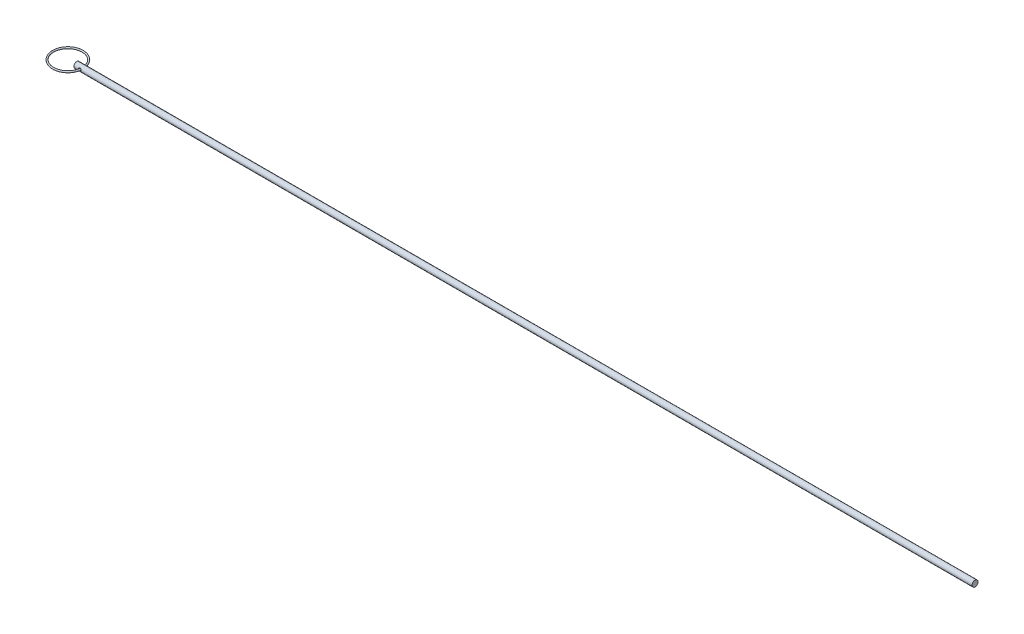
ISO-10303-21;
HEADER;
FILE_DESCRIPTION(('STEP AP214'),'2;1');
FILE_NAME('part.step','',(''),(''),'','','');
FILE_SCHEMA(('AUTOMOTIVE_DESIGN { 1 0 10303 214 1 1 1 1 }'));
ENDSEC;
DATA;
#1=APPLICATION_CONTEXT('core data for automotive mechanical design processes');
#2=APPLICATION_PROTOCOL_DEFINITION('international standard','automotive_design',2000,#1);
#3=PRODUCT_CONTEXT('',#1,'mechanical');
#4=PRODUCT('Part','Part','',(#3));
#5=PRODUCT_RELATED_PRODUCT_CATEGORY('part','',(#4));
#6=PRODUCT_DEFINITION_FORMATION('','',#4);
#7=PRODUCT_DEFINITION_CONTEXT('part definition',#1,'design');
#8=PRODUCT_DEFINITION('design','',#6,#7);
#9=PRODUCT_DEFINITION_SHAPE('','',#8);
#10=(LENGTH_UNIT() NAMED_UNIT(*) SI_UNIT(.MILLI.,.METRE.));
#11=(NAMED_UNIT(*) PLANE_ANGLE_UNIT() SI_UNIT($,.RADIAN.));
#12=(NAMED_UNIT(*) SI_UNIT($,.STERADIAN.) SOLID_ANGLE_UNIT());
#13=UNCERTAINTY_MEASURE_WITH_UNIT(LENGTH_MEASURE(1.E-05),#10,'distance_accuracy_value','');
#14=(GEOMETRIC_REPRESENTATION_CONTEXT(3) GLOBAL_UNCERTAINTY_ASSIGNED_CONTEXT((#13)) GLOBAL_UNIT_ASSIGNED_CONTEXT((#10,
#11,#12)) REPRESENTATION_CONTEXT('',''));
#15=CARTESIAN_POINT('',(0.,0.,0.));
#16=DIRECTION('',(0.,0.,1.));
#17=DIRECTION('',(1.,0.,0.));
#18=AXIS2_PLACEMENT_3D('',#15,#16,#17);
#19=CARTESIAN_POINT('',(-1.5,0.,0.));
#20=DIRECTION('',(0.,1.,0.));
#21=DIRECTION('',(-1.,0.,0.));
#22=AXIS2_PLACEMENT_3D('',#19,#20,#21);
#23=TOROIDAL_SURFACE('',#22,2.5,0.127);
#24=CARTESIAN_POINT('',(-4.127,0.,0.));
#25=VERTEX_POINT('',#24);
#26=VERTEX_LOOP('',#25);
#27=FACE_BOUND('',#26,.T.);
#28=ADVANCED_FACE('F49',(#27),#23,.T.);
#29=CLOSED_SHELL('',(#28));
#30=MANIFOLD_SOLID_BREP('B2',#29);
#31=CARTESIAN_POINT('',(152.4,0.,0.));
#32=DIRECTION('',(-1.,0.,0.));
#33=DIRECTION('',(0.,0.,1.));
#34=AXIS2_PLACEMENT_3D('',#31,#32,#33);
#35=CYLINDRICAL_SURFACE('',#34,0.5);
#36=CARTESIAN_POINT('',(1.25,0.,-0.5));
#37=CARTESIAN_POINT('',(1.24999917442012,0.0131429907382462,-0.499999283510377));
#38=CARTESIAN_POINT('',(1.24895748171958,0.0263016499245073,-0.499476227548794));
#39=CARTESIAN_POINT('',(1.24483677991477,0.0522300588171047,-0.497435390093491));
#40=CARTESIAN_POINT('',(1.24175390175059,0.0649990216783739,-0.495915719572459));
#41=CARTESIAN_POINT('',(1.2337015478458,0.0897333862201409,-0.492040698508279));
#42=CARTESIAN_POINT('',(1.228739403938,0.101701700734792,-0.489688597943801));
#43=CARTESIAN_POINT('',(1.21710734465877,0.124618154201638,-0.484364441289447));
#44=CARTESIAN_POINT('',(1.21043756393779,0.135566373497509,-0.481392434083826));
#45=CARTESIAN_POINT('',(1.19512068762868,0.156876954440476,-0.474890645645144));
#46=CARTESIAN_POINT('',(1.18637838019009,0.167163802780524,-0.471337997818841));
#47=CARTESIAN_POINT('',(1.16736963018825,0.18619486121674,-0.464149925616862));
#48=CARTESIAN_POINT('',(1.15710203705689,0.194937895776688,-0.460514440522589));
#49=CARTESIAN_POINT('',(1.13437916261916,0.211313000112566,-0.453247377993369));
#50=CARTESIAN_POINT('',(1.12181597541353,0.218806333887907,-0.449637967425331));
#51=CARTESIAN_POINT('',(1.09540816600345,0.231542056722672,-0.443214946930802));
#52=CARTESIAN_POINT('',(1.08156446781932,0.236786053741582,-0.440400769017475));
#53=CARTESIAN_POINT('',(1.05383372364452,0.244533110547147,-0.436144667594522));
#54=CARTESIAN_POINT('',(1.03999888698315,0.24718146427011,-0.434630678959284));
#55=CARTESIAN_POINT('',(1.01200529055513,0.250106748327211,-0.432954724871319));
#56=CARTESIAN_POINT('',(0.997846864782208,0.250386022093268,-0.43279142335822));
#57=CARTESIAN_POINT('',(0.971428493921153,0.248671821793073,-0.433777325643121));
#58=CARTESIAN_POINT('',(0.959143992194233,0.246946139884204,-0.434771909155034));
#59=CARTESIAN_POINT('',(0.935069522656735,0.241734962264231,-0.437690571834627));
#60=CARTESIAN_POINT('',(0.923279713673666,0.238248905974411,-0.439614947079442));
#61=CARTESIAN_POINT('',(0.900192716858581,0.229552445096499,-0.444218691031854));
#62=CARTESIAN_POINT('',(0.888913400303549,0.224303766778996,-0.446914601659998));
#63=CARTESIAN_POINT('',(0.867341426852495,0.212260421916998,-0.45275851070351));
#64=CARTESIAN_POINT('',(0.857049216099975,0.205465060953115,-0.455906711950477));
#65=CARTESIAN_POINT('',(0.836369686814192,0.189516513728196,-0.462782894758215));
#66=CARTESIAN_POINT('',(0.82613578160596,0.18017361459232,-0.466533775591866));
#67=CARTESIAN_POINT('',(0.807316145352276,0.159888894685344,-0.473869058251018));
#68=CARTESIAN_POINT('',(0.798731201991531,0.148946314143573,-0.477453379897002));
#69=CARTESIAN_POINT('',(0.78307858474257,0.125129126457965,-0.484254968207409));
#70=CARTESIAN_POINT('',(0.776099881888567,0.112188397899855,-0.487447460405018));
#71=CARTESIAN_POINT('',(0.76447574273925,0.0851165538722036,-0.492894702803105));
#72=CARTESIAN_POINT('',(0.75982845374621,0.0709863940663242,-0.495150197358881));
#73=CARTESIAN_POINT('',(0.753381149070832,0.0431916229151808,-0.49831083435359));
#74=CARTESIAN_POINT('',(0.751377191063306,0.0295853826370862,-0.499312345753279));
#75=CARTESIAN_POINT('',(0.749633817216378,0.00219489998734287,-0.500182533647755));
#76=CARTESIAN_POINT('',(0.74989332859013,-0.0115892549674712,-0.500051746803281));
#77=CARTESIAN_POINT('',(0.752551672104688,-0.0378082429964952,-0.498727980633602));
#78=CARTESIAN_POINT('',(0.754783133182507,-0.050264852012486,-0.497618114220474));
#79=CARTESIAN_POINT('',(0.761059517973771,-0.0746017230754778,-0.494555428287048));
#80=CARTESIAN_POINT('',(0.76510464161334,-0.0864819214227484,-0.492602515835831));
#81=CARTESIAN_POINT('',(0.774999616608293,-0.109722152112416,-0.487960628534174));
#82=CARTESIAN_POINT('',(0.780897762529204,-0.121057599251539,-0.485252204424848));
#83=CARTESIAN_POINT('',(0.794276883911512,-0.142615340424731,-0.479359935792772));
#84=CARTESIAN_POINT('',(0.801758533648359,-0.152837157443822,-0.476175888914462));
#85=CARTESIAN_POINT('',(0.81894010633322,-0.172941922322665,-0.46927055334366));
#86=CARTESIAN_POINT('',(0.828785717113393,-0.182693019456161,-0.465527212121103));
#87=CARTESIAN_POINT('',(0.849981287817328,-0.200464080278311,-0.458155979009686));
#88=CARTESIAN_POINT('',(0.861332279704096,-0.208482846422711,-0.454528168453815));
#89=CARTESIAN_POINT('',(0.885910913550079,-0.222926978624424,-0.44762798056517));
#90=CARTESIAN_POINT('',(0.899202816552149,-0.229256373969659,-0.44438132415868));
#91=CARTESIAN_POINT('',(0.926877516923129,-0.23952070650345,-0.438935180920316));
#92=CARTESIAN_POINT('',(0.941258881625295,-0.243458728971892,-0.436734345601546));
#93=CARTESIAN_POINT('',(0.969227555715359,-0.248465421862419,-0.433903752521667));
#94=CARTESIAN_POINT('',(0.982758563357255,-0.249773249100216,-0.433143458651228));
#95=CARTESIAN_POINT('',(1.00986176679268,-0.250172288595197,-0.432913386615437));
#96=CARTESIAN_POINT('',(1.02343394218485,-0.2492644616561,-0.433443049068881));
#97=CARTESIAN_POINT('',(1.048870875383,-0.245481531398067,-0.435594655125061));
#98=CARTESIAN_POINT('',(1.06077511753609,-0.242802078585701,-0.437107736205983));
#99=CARTESIAN_POINT('',(1.08395202985617,-0.235793839556164,-0.440927540469792));
#100=CARTESIAN_POINT('',(1.09522449552298,-0.231464522789955,-0.443234518924188));
#101=CARTESIAN_POINT('',(1.11765621274664,-0.220953936325174,-0.448571325911318));
#102=CARTESIAN_POINT('',(1.12875697545742,-0.214667784454118,-0.451639305990475));
#103=CARTESIAN_POINT('',(1.14981863404514,-0.200537742909162,-0.458088329086474));
#104=CARTESIAN_POINT('',(1.15977893262962,-0.192693042809665,-0.461469534486304));
#105=CARTESIAN_POINT('',(1.1795354955894,-0.174550831666163,-0.468655807898282));
#106=CARTESIAN_POINT('',(1.18916477559048,-0.164071105752545,-0.472462458278671));
#107=CARTESIAN_POINT('',(1.20656574585591,-0.141538701555071,-0.479694380637719));
#108=CARTESIAN_POINT('',(1.21433643485657,-0.129485180814196,-0.4831194465201));
#109=CARTESIAN_POINT('',(1.22780909069055,-0.103982899204986,-0.489245023962758));
#110=CARTESIAN_POINT('',(1.23349604235286,-0.0905248759836522,-0.491940241407272));
#111=CARTESIAN_POINT('',(1.24245204197974,-0.0626855253235458,-0.496253353408664));
#112=CARTESIAN_POINT('',(1.24572796170739,-0.0483069499057891,-0.49787430843233));
#113=CARTESIAN_POINT('',(1.24847435276896,-0.0281504866208436,-0.499238654774158));
#114=CARTESIAN_POINT('',(1.2490456602159,-0.0225404698598728,-0.499523413348004));
#115=CARTESIAN_POINT('',(1.2498086663792,-0.0112879329517884,-0.499904242444662));
#116=CARTESIAN_POINT('',(1.2500003546178,-0.00564541191184486,-0.500000307759408));
#117=CARTESIAN_POINT('',(1.25,0.,-0.5));
#118=B_SPLINE_CURVE_WITH_KNOTS('',3,(#36,#37,#38,#39,#40,#41,#42,#43,#44,#45,#46,#47,#48,#49,
#50,#51,#52,#53,#54,#55,#56,#57,#58,#59,#60,#61,#62,#63,#64,#65,#66,#67,#68,#69,#70,#71,#72,#73,
#74,#75,#76,#77,#78,#79,#80,#81,#82,#83,#84,#85,#86,#87,#88,#89,#90,#91,#92,#93,#94,#95,#96,#97,
#98,#99,#100,#101,#102,#103,#104,#105,#106,#107,#108,#109,#110,#111,#112,#113,#114,#115,#116,
#117),.UNSPECIFIED.,.T.,.F.,(4,2,2,2,2,2,2,2,2,2,2,2,2,2,2,2,2,2,2,2,2,2,2,2,2,2,2,2,2,2,2,2,2,
2,2,2,2,2,2,2,4),(0.,0.0394060643550719,0.078887037427297,0.118215538873071,0.157540940145387,
0.199245439679516,0.240981559413502,0.285954316076877,0.330894869745699,0.373145030350574,
0.415353393322555,0.452514281023306,0.489687009814201,0.527725600421222,0.565781303150556,
0.608662353334695,0.651563836496712,0.696457555536096,0.741315542280692,0.782458226178358,
0.823581411278685,0.861517266265302,0.899457304077327,0.938482140069746,0.977523626870849,
1.02039902661105,1.06330397153858,1.10828670539918,1.15321127985194,1.19382326874593,
1.23441764965,1.27114482561045,1.30788382195919,1.34709114193903,1.38631890284739,
1.43031310688124,1.47433095844143,1.51866003415731,1.56286227156233,1.57978820034424,
1.59671459628711),.UNSPECIFIED.);
#119=CARTESIAN_POINT('',(1.25,0.,-0.5));
#120=VERTEX_POINT('',#119);
#121=EDGE_CURVE('E48',#120,#120,#118,.T.);
#122=ORIENTED_EDGE('',*,*,#121,.T.);
#123=EDGE_LOOP('',(#122));
#124=FACE_BOUND('',#123,.T.);
#125=CARTESIAN_POINT('',(1.25,0.,0.5));
#126=CARTESIAN_POINT('',(1.24999917442012,-0.0131429907382462,0.499999283510377));
#127=CARTESIAN_POINT('',(1.24895748171958,-0.0263016499245073,0.499476227548794));
#128=CARTESIAN_POINT('',(1.24483677991477,-0.0522300588171047,0.497435390093491));
#129=CARTESIAN_POINT('',(1.24175390175059,-0.0649990216783739,0.495915719572459));
#130=CARTESIAN_POINT('',(1.2337015478458,-0.0897333862201409,0.492040698508279));
#131=CARTESIAN_POINT('',(1.228739403938,-0.101701700734792,0.489688597943801));
#132=CARTESIAN_POINT('',(1.21710734465877,-0.124618154201638,0.484364441289447));
#133=CARTESIAN_POINT('',(1.21043756393779,-0.135566373497509,0.481392434083826));
#134=CARTESIAN_POINT('',(1.19512068762868,-0.156876954440476,0.474890645645144));
#135=CARTESIAN_POINT('',(1.18637838019009,-0.167163802780524,0.471337997818841));
#136=CARTESIAN_POINT('',(1.16736963018825,-0.18619486121674,0.464149925616862));
#137=CARTESIAN_POINT('',(1.15710203705689,-0.194937895776688,0.460514440522589));
#138=CARTESIAN_POINT('',(1.13437916261916,-0.211313000112566,0.453247377993369));
#139=CARTESIAN_POINT('',(1.12181597541353,-0.218806333887907,0.449637967425331));
#140=CARTESIAN_POINT('',(1.09540816600345,-0.231542056722672,0.443214946930802));
#141=CARTESIAN_POINT('',(1.08156446781932,-0.236786053741582,0.440400769017475));
#142=CARTESIAN_POINT('',(1.05383372364452,-0.244533110547147,0.436144667594522));
#143=CARTESIAN_POINT('',(1.03999888698315,-0.24718146427011,0.434630678959284));
#144=CARTESIAN_POINT('',(1.01200529055513,-0.250106748327211,0.432954724871319));
#145=CARTESIAN_POINT('',(0.997846864782208,-0.250386022093268,0.43279142335822));
#146=CARTESIAN_POINT('',(0.971428493921153,-0.248671821793073,0.433777325643122));
#147=CARTESIAN_POINT('',(0.959143992194233,-0.246946139884204,0.434771909155034));
#148=CARTESIAN_POINT('',(0.935069522656735,-0.241734962264231,0.437690571834627));
#149=CARTESIAN_POINT('',(0.923279713673666,-0.238248905974411,0.439614947079442));
#150=CARTESIAN_POINT('',(0.900192716858581,-0.229552445096499,0.444218691031854));
#151=CARTESIAN_POINT('',(0.888913400303549,-0.224303766778996,0.446914601659998));
#152=CARTESIAN_POINT('',(0.867341426852495,-0.212260421916998,0.45275851070351));
#153=CARTESIAN_POINT('',(0.857049216099975,-0.205465060953115,0.455906711950477));
#154=CARTESIAN_POINT('',(0.836369686814192,-0.189516513728196,0.462782894758215));
#155=CARTESIAN_POINT('',(0.82613578160596,-0.18017361459232,0.466533775591866));
#156=CARTESIAN_POINT('',(0.807316145352275,-0.159888894685344,0.473869058251018));
#157=CARTESIAN_POINT('',(0.798731201991531,-0.148946314143572,0.477453379897002));
#158=CARTESIAN_POINT('',(0.78307858474257,-0.125129126457965,0.484254968207409));
#159=CARTESIAN_POINT('',(0.776099881888567,-0.112188397899855,0.487447460405018));
#160=CARTESIAN_POINT('',(0.76447574273925,-0.0851165538722036,0.492894702803104));
#161=CARTESIAN_POINT('',(0.75982845374621,-0.0709863940663241,0.495150197358881));
#162=CARTESIAN_POINT('',(0.753381149070832,-0.0431916229151808,0.49831083435359));
#163=CARTESIAN_POINT('',(0.751377191063306,-0.0295853826370862,0.499312345753279));
#164=CARTESIAN_POINT('',(0.749633817216378,-0.00219489998734292,0.500182533647755));
#165=CARTESIAN_POINT('',(0.74989332859013,0.0115892549674712,0.500051746803281));
#166=CARTESIAN_POINT('',(0.752551672104688,0.0378082429964952,0.498727980633602));
#167=CARTESIAN_POINT('',(0.754783133182507,0.050264852012486,0.497618114220474));
#168=CARTESIAN_POINT('',(0.761059517973771,0.0746017230754778,0.494555428287048));
#169=CARTESIAN_POINT('',(0.76510464161334,0.0864819214227484,0.492602515835831));
#170=CARTESIAN_POINT('',(0.774999616608293,0.109722152112416,0.487960628534174));
#171=CARTESIAN_POINT('',(0.780897762529204,0.121057599251539,0.485252204424848));
#172=CARTESIAN_POINT('',(0.794276883911512,0.142615340424731,0.479359935792772));
#173=CARTESIAN_POINT('',(0.801758533648359,0.152837157443822,0.476175888914462));
#174=CARTESIAN_POINT('',(0.81894010633322,0.172941922322665,0.46927055334366));
#175=CARTESIAN_POINT('',(0.828785717113393,0.182693019456161,0.465527212121103));
#176=CARTESIAN_POINT('',(0.849981287817328,0.200464080278311,0.458155979009686));
#177=CARTESIAN_POINT('',(0.861332279704096,0.208482846422711,0.454528168453815));
#178=CARTESIAN_POINT('',(0.88591091355008,0.222926978624424,0.44762798056517));
#179=CARTESIAN_POINT('',(0.89920281655215,0.229256373969659,0.44438132415868));
#180=CARTESIAN_POINT('',(0.92687751692313,0.23952070650345,0.438935180920316));
#181=CARTESIAN_POINT('',(0.941258881625295,0.243458728971892,0.436734345601546));
#182=CARTESIAN_POINT('',(0.969227555715359,0.248465421862419,0.433903752521667));
#183=CARTESIAN_POINT('',(0.982758563357255,0.249773249100216,0.433143458651228));
#184=CARTESIAN_POINT('',(1.00986176679268,0.250172288595197,0.432913386615437));
#185=CARTESIAN_POINT('',(1.02343394218485,0.2492644616561,0.433443049068881));
#186=CARTESIAN_POINT('',(1.048870875383,0.245481531398067,0.435594655125061));
#187=CARTESIAN_POINT('',(1.06077511753609,0.242802078585701,0.437107736205983));
#188=CARTESIAN_POINT('',(1.08395202985617,0.235793839556164,0.440927540469792));
#189=CARTESIAN_POINT('',(1.09522449552298,0.231464522789955,0.443234518924188));
#190=CARTESIAN_POINT('',(1.11765621274664,0.220953936325174,0.448571325911318));
#191=CARTESIAN_POINT('',(1.12875697545742,0.214667784454118,0.451639305990475));
#192=CARTESIAN_POINT('',(1.14981863404514,0.200537742909162,0.458088329086474));
#193=CARTESIAN_POINT('',(1.15977893262962,0.192693042809665,0.461469534486304));
#194=CARTESIAN_POINT('',(1.1795354955894,0.174550831666163,0.468655807898282));
#195=CARTESIAN_POINT('',(1.18916477559048,0.164071105752544,0.472462458278671));
#196=CARTESIAN_POINT('',(1.20656574585591,0.14153870155507,0.479694380637719));
#197=CARTESIAN_POINT('',(1.21433643485657,0.129485180814196,0.4831194465201));
#198=CARTESIAN_POINT('',(1.22780909069055,0.103982899204986,0.489245023962758));
#199=CARTESIAN_POINT('',(1.23349604235286,0.0905248759836521,0.491940241407273));
#200=CARTESIAN_POINT('',(1.24245204197974,0.0626855253235457,0.496253353408664));
#201=CARTESIAN_POINT('',(1.24572796170739,0.0483069499057891,0.49787430843233));
#202=CARTESIAN_POINT('',(1.24847435276896,0.0281504866208437,0.499238654774158));
#203=CARTESIAN_POINT('',(1.2490456602159,0.0225404698598729,0.499523413348004));
#204=CARTESIAN_POINT('',(1.2498086663792,0.0112879329517886,0.499904242444662));
#205=CARTESIAN_POINT('',(1.2500003546178,0.00564541191184494,0.500000307759408));
#206=CARTESIAN_POINT('',(1.25,0.,0.5));
#207=B_SPLINE_CURVE_WITH_KNOTS('',3,(#125,#126,#127,#128,#129,#130,#131,#132,#133,#134,#135,
#136,#137,#138,#139,#140,#141,#142,#143,#144,#145,#146,#147,#148,#149,#150,#151,#152,#153,#154,
#155,#156,#157,#158,#159,#160,#161,#162,#163,#164,#165,#166,#167,#168,#169,#170,#171,#172,#173,
#174,#175,#176,#177,#178,#179,#180,#181,#182,#183,#184,#185,#186,#187,#188,#189,#190,#191,#192,
#193,#194,#195,#196,#197,#198,#199,#200,#201,#202,#203,#204,#205,#206),.UNSPECIFIED.,.T.,.F.,(4,
2,2,2,2,2,2,2,2,2,2,2,2,2,2,2,2,2,2,2,2,2,2,2,2,2,2,2,2,2,2,2,2,2,2,2,2,2,2,2,4),(0.,
0.0394060643550719,0.078887037427297,0.118215538873071,0.157540940145387,0.199245439679516,
0.240981559413502,0.285954316076877,0.330894869745699,0.373145030350574,0.415353393322555,
0.452514281023306,0.489687009814201,0.527725600421222,0.565781303150556,0.608662353334695,
0.651563836496712,0.696457555536096,0.741315542280692,0.782458226178358,0.823581411278685,
0.861517266265302,0.899457304077327,0.938482140069746,0.977523626870849,1.02039902661105,
1.06330397153858,1.10828670539918,1.15321127985194,1.19382326874593,1.23441764965,
1.27114482561045,1.30788382195919,1.34709114193903,1.38631890284739,1.43031310688124,
1.47433095844143,1.51866003415731,1.56286227156233,1.57978820034424,1.59671459628711),.UNSPECIFIED.);
#208=CARTESIAN_POINT('',(1.25,0.,0.5));
#209=VERTEX_POINT('',#208);
#210=EDGE_CURVE('E74',#209,#209,#207,.T.);
#211=ORIENTED_EDGE('',*,*,#210,.T.);
#212=EDGE_LOOP('',(#211));
#213=FACE_BOUND('',#212,.T.);
#214=CARTESIAN_POINT('',(152.4,0.,0.));
#215=DIRECTION('',(1.,0.,0.));
#216=DIRECTION('',(0.,0.,-1.));
#217=AXIS2_PLACEMENT_3D('',#214,#215,#216);
#218=CIRCLE('',#217,0.5);
#219=CARTESIAN_POINT('',(152.4,0.,-0.5));
#220=VERTEX_POINT('',#219);
#221=EDGE_CURVE('E79',#220,#220,#218,.T.);
#222=ORIENTED_EDGE('',*,*,#221,.F.);
#223=EDGE_LOOP('',(#222));
#224=FACE_BOUND('',#223,.T.);
#225=CARTESIAN_POINT('',(0.,0.,0.));
#226=DIRECTION('',(1.,0.,0.));
#227=DIRECTION('',(0.,0.,-1.));
#228=AXIS2_PLACEMENT_3D('',#225,#226,#227);
#229=CIRCLE('',#228,0.5);
#230=CARTESIAN_POINT('',(0.,0.,-0.5));
#231=VERTEX_POINT('',#230);
#232=EDGE_CURVE('E84',#231,#231,#229,.T.);
#233=ORIENTED_EDGE('',*,*,#232,.T.);
#234=EDGE_LOOP('',(#233));
#235=FACE_BOUND('',#234,.T.);
#236=ADVANCED_FACE('F62',(#124,#213,#224,#235),#35,.T.);
#237=CARTESIAN_POINT('',(152.4,0.,0.));
#238=DIRECTION('',(1.,0.,0.));
#239=DIRECTION('',(0.,0.,-1.));
#240=AXIS2_PLACEMENT_3D('',#237,#238,#239);
#241=PLANE('',#240);
#242=ORIENTED_EDGE('',*,*,#221,.T.);
#243=EDGE_LOOP('',(#242));
#244=FACE_BOUND('',#243,.T.);
#245=ADVANCED_FACE('F96',(#244),#241,.T.);
#246=CARTESIAN_POINT('',(0.,0.,0.));
#247=DIRECTION('',(1.,0.,0.));
#248=DIRECTION('',(0.,0.,-1.));
#249=AXIS2_PLACEMENT_3D('',#246,#247,#248);
#250=PLANE('',#249);
#251=ORIENTED_EDGE('',*,*,#232,.F.);
#252=EDGE_LOOP('',(#251));
#253=FACE_BOUND('',#252,.T.);
#254=ADVANCED_FACE('F94',(#253),#250,.F.);
#255=CARTESIAN_POINT('',(1.,0.,-0.5));
#256=DIRECTION('',(0.,0.,1.));
#257=DIRECTION('',(1.,0.,0.));
#258=AXIS2_PLACEMENT_3D('',#255,#256,#257);
#259=CYLINDRICAL_SURFACE('',#258,0.25);
#260=ORIENTED_EDGE('',*,*,#210,.F.);
#261=EDGE_LOOP('',(#260));
#262=FACE_BOUND('',#261,.T.);
#263=ORIENTED_EDGE('',*,*,#121,.F.);
#264=EDGE_LOOP('',(#263));
#265=FACE_BOUND('',#264,.T.);
#266=ADVANCED_FACE('F90',(#262,#265),#259,.F.);
#267=CLOSED_SHELL('',(#236,#245,#254,#266));
#268=MANIFOLD_SOLID_BREP('B6',#267);
#269=ADVANCED_BREP_SHAPE_REPRESENTATION('',(#18,#30,#268),#14);
#270=SHAPE_DEFINITION_REPRESENTATION(#9,#269);
ENDSEC;
END-ISO-10303-21;
